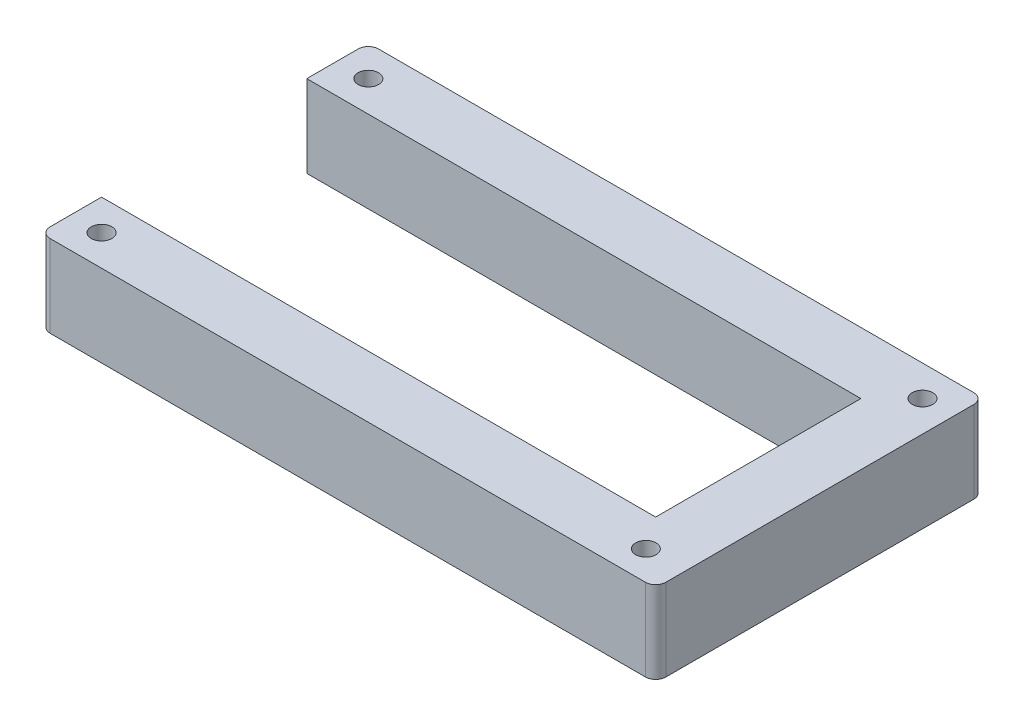
ISO-10303-21;
HEADER;
FILE_DESCRIPTION(('STEP AP214'),'2;1');
FILE_NAME('part.step','',(''),(''),'','','');
FILE_SCHEMA(('AUTOMOTIVE_DESIGN { 1 0 10303 214 1 1 1 1 }'));
ENDSEC;
DATA;
#1=APPLICATION_CONTEXT('core data for automotive mechanical design processes');
#2=APPLICATION_PROTOCOL_DEFINITION('international standard','automotive_design',2000,#1);
#3=PRODUCT_CONTEXT('',#1,'mechanical');
#4=PRODUCT('Part','Part','',(#3));
#5=PRODUCT_RELATED_PRODUCT_CATEGORY('part','',(#4));
#6=PRODUCT_DEFINITION_FORMATION('','',#4);
#7=PRODUCT_DEFINITION_CONTEXT('part definition',#1,'design');
#8=PRODUCT_DEFINITION('design','',#6,#7);
#9=PRODUCT_DEFINITION_SHAPE('','',#8);
#10=(LENGTH_UNIT() NAMED_UNIT(*) SI_UNIT(.MILLI.,.METRE.));
#11=(NAMED_UNIT(*) PLANE_ANGLE_UNIT() SI_UNIT($,.RADIAN.));
#12=(NAMED_UNIT(*) SI_UNIT($,.STERADIAN.) SOLID_ANGLE_UNIT());
#13=UNCERTAINTY_MEASURE_WITH_UNIT(LENGTH_MEASURE(1.E-05),#10,'distance_accuracy_value','');
#14=(GEOMETRIC_REPRESENTATION_CONTEXT(3) GLOBAL_UNCERTAINTY_ASSIGNED_CONTEXT((#13)) GLOBAL_UNIT_ASSIGNED_CONTEXT((#10,
#11,#12)) REPRESENTATION_CONTEXT('',''));
#15=CARTESIAN_POINT('',(0.,0.,0.));
#16=DIRECTION('',(0.,0.,1.));
#17=DIRECTION('',(1.,0.,0.));
#18=AXIS2_PLACEMENT_3D('',#15,#16,#17);
#19=CARTESIAN_POINT('',(63.5,508.,-63.5));
#20=DIRECTION('',(0.,-1.,0.));
#21=DIRECTION('',(0.,0.,-1.));
#22=AXIS2_PLACEMENT_3D('',#19,#20,#21);
#23=PLANE('',#22);
#24=DIRECTION('',(1.,0.,0.));
#25=VECTOR('',#24,1.);
#26=CARTESIAN_POINT('',(0.,508.,-1651.));
#27=LINE('',#26,#25);
#28=CARTESIAN_POINT('',(0.,508.,-1651.));
#29=VERTEX_POINT('',#28);
#30=CARTESIAN_POINT('',(3429.,508.,-1651.));
#31=VERTEX_POINT('',#30);
#32=EDGE_CURVE('E190',#29,#31,#27,.T.);
#33=ORIENTED_EDGE('',*,*,#32,.T.);
#34=DIRECTION('',(0.,0.,1.));
#35=VECTOR('',#34,1.);
#36=CARTESIAN_POINT('',(3429.,508.,-1651.));
#37=LINE('',#36,#35);
#38=CARTESIAN_POINT('',(3429.,508.,-381.));
#39=VERTEX_POINT('',#38);
#40=EDGE_CURVE('E113',#31,#39,#37,.T.);
#41=ORIENTED_EDGE('',*,*,#40,.T.);
#42=DIRECTION('',(-1.,0.,0.));
#43=VECTOR('',#42,1.);
#44=CARTESIAN_POINT('',(3429.,508.,-381.));
#45=LINE('',#44,#43);
#46=CARTESIAN_POINT('',(0.,508.,-381.));
#47=VERTEX_POINT('',#46);
#48=EDGE_CURVE('E215',#39,#47,#45,.T.);
#49=ORIENTED_EDGE('',*,*,#48,.T.);
#50=DIRECTION('',(0.,0.,1.));
#51=VECTOR('',#50,1.);
#52=CARTESIAN_POINT('',(0.,508.,-381.));
#53=LINE('',#52,#51);
#54=CARTESIAN_POINT('',(0.,508.,-63.5000000000004));
#55=VERTEX_POINT('',#54);
#56=EDGE_CURVE('E232',#47,#55,#53,.T.);
#57=ORIENTED_EDGE('',*,*,#56,.T.);
#58=CARTESIAN_POINT('',(63.5,508.,-63.5));
#59=DIRECTION('',(0.,1.,0.));
#60=DIRECTION('',(0.,0.,-1.));
#61=AXIS2_PLACEMENT_3D('',#58,#59,#60);
#62=CIRCLE('',#61,63.5);
#63=CARTESIAN_POINT('',(63.5000000000005,508.,0.));
#64=VERTEX_POINT('',#63);
#65=EDGE_CURVE('E229',#55,#64,#62,.T.);
#66=ORIENTED_EDGE('',*,*,#65,.T.);
#67=DIRECTION('',(1.,0.,0.));
#68=VECTOR('',#67,1.);
#69=CARTESIAN_POINT('',(63.5000000000005,508.,0.));
#70=LINE('',#69,#68);
#71=CARTESIAN_POINT('',(3746.5,508.,0.));
#72=VERTEX_POINT('',#71);
#73=EDGE_CURVE('E235',#64,#72,#70,.T.);
#74=ORIENTED_EDGE('',*,*,#73,.T.);
#75=CARTESIAN_POINT('',(3746.5,508.,-63.5));
#76=DIRECTION('',(0.,1.,0.));
#77=DIRECTION('',(0.,0.,1.));
#78=AXIS2_PLACEMENT_3D('',#75,#76,#77);
#79=CIRCLE('',#78,63.4999999999999);
#80=CARTESIAN_POINT('',(3810.,508.,-63.5000000000005));
#81=VERTEX_POINT('',#80);
#82=EDGE_CURVE('E234',#72,#81,#79,.T.);
#83=ORIENTED_EDGE('',*,*,#82,.T.);
#84=DIRECTION('',(0.,0.,-1.));
#85=VECTOR('',#84,1.);
#86=CARTESIAN_POINT('',(3810.,508.,-63.5000000000005));
#87=LINE('',#86,#85);
#88=CARTESIAN_POINT('',(3810.,508.,-1968.5));
#89=VERTEX_POINT('',#88);
#90=EDGE_CURVE('E241',#81,#89,#87,.T.);
#91=ORIENTED_EDGE('',*,*,#90,.T.);
#92=CARTESIAN_POINT('',(3746.5,508.,-1968.5));
#93=DIRECTION('',(0.,1.,0.));
#94=DIRECTION('',(0.,0.,1.));
#95=AXIS2_PLACEMENT_3D('',#92,#93,#94);
#96=CIRCLE('',#95,63.4999999999999);
#97=CARTESIAN_POINT('',(3746.5,508.,-2032.));
#98=VERTEX_POINT('',#97);
#99=EDGE_CURVE('E147',#89,#98,#96,.T.);
#100=ORIENTED_EDGE('',*,*,#99,.T.);
#101=DIRECTION('',(-1.,0.,0.));
#102=VECTOR('',#101,1.);
#103=CARTESIAN_POINT('',(3746.5,508.,-2032.));
#104=LINE('',#103,#102);
#105=CARTESIAN_POINT('',(63.5000000000005,508.,-2032.));
#106=VERTEX_POINT('',#105);
#107=EDGE_CURVE('E139',#98,#106,#104,.T.);
#108=ORIENTED_EDGE('',*,*,#107,.T.);
#109=CARTESIAN_POINT('',(63.5,508.,-1968.5));
#110=DIRECTION('',(0.,1.,0.));
#111=DIRECTION('',(0.,0.,1.));
#112=AXIS2_PLACEMENT_3D('',#109,#110,#111);
#113=CIRCLE('',#112,63.4999999999999);
#114=CARTESIAN_POINT('',(0.,508.,-1968.5));
#115=VERTEX_POINT('',#114);
#116=EDGE_CURVE('E143',#106,#115,#113,.T.);
#117=ORIENTED_EDGE('',*,*,#116,.T.);
#118=DIRECTION('',(0.,0.,1.));
#119=VECTOR('',#118,1.);
#120=CARTESIAN_POINT('',(0.,508.,-1968.5));
#121=LINE('',#120,#119);
#122=EDGE_CURVE('E58',#115,#29,#121,.T.);
#123=ORIENTED_EDGE('',*,*,#122,.T.);
#124=EDGE_LOOP('',(#33,#41,#49,#57,#66,#74,#83,#91,#100,#108,#117,#123));
#125=FACE_BOUND('',#124,.T.);
#126=CARTESIAN_POINT('',(190.5,508.,-1841.5));
#127=DIRECTION('',(0.,1.,0.));
#128=DIRECTION('',(0.,0.,1.));
#129=AXIS2_PLACEMENT_3D('',#126,#127,#128);
#130=CIRCLE('',#129,63.5);
#131=CARTESIAN_POINT('',(190.5,508.,-1778.));
#132=VERTEX_POINT('',#131);
#133=EDGE_CURVE('E166',#132,#132,#130,.T.);
#134=ORIENTED_EDGE('',*,*,#133,.F.);
#135=EDGE_LOOP('',(#134));
#136=FACE_BOUND('',#135,.T.);
#137=CARTESIAN_POINT('',(190.5,508.,-190.5));
#138=DIRECTION('',(0.,1.,0.));
#139=DIRECTION('',(0.,0.,1.));
#140=AXIS2_PLACEMENT_3D('',#137,#138,#139);
#141=CIRCLE('',#140,63.5);
#142=CARTESIAN_POINT('',(190.5,508.,-127.));
#143=VERTEX_POINT('',#142);
#144=EDGE_CURVE('E304',#143,#143,#141,.T.);
#145=ORIENTED_EDGE('',*,*,#144,.F.);
#146=EDGE_LOOP('',(#145));
#147=FACE_BOUND('',#146,.T.);
#148=CARTESIAN_POINT('',(3568.73960956834,508.,-180.492968070862));
#149=DIRECTION('',(0.,1.,0.));
#150=DIRECTION('',(0.,0.,1.));
#151=AXIS2_PLACEMENT_3D('',#148,#149,#150);
#152=CIRCLE('',#151,63.4999999999999);
#153=CARTESIAN_POINT('',(3568.73960956834,508.,-116.992968070862));
#154=VERTEX_POINT('',#153);
#155=EDGE_CURVE('E298',#154,#154,#152,.T.);
#156=ORIENTED_EDGE('',*,*,#155,.F.);
#157=EDGE_LOOP('',(#156));
#158=FACE_BOUND('',#157,.T.);
#159=CARTESIAN_POINT('',(3619.5,508.,-1841.5));
#160=DIRECTION('',(0.,1.,0.));
#161=DIRECTION('',(0.,0.,1.));
#162=AXIS2_PLACEMENT_3D('',#159,#160,#161);
#163=CIRCLE('',#162,63.4999999999998);
#164=CARTESIAN_POINT('',(3619.5,508.,-1778.));
#165=VERTEX_POINT('',#164);
#166=EDGE_CURVE('E290',#165,#165,#163,.T.);
#167=ORIENTED_EDGE('',*,*,#166,.F.);
#168=EDGE_LOOP('',(#167));
#169=FACE_BOUND('',#168,.T.);
#170=ADVANCED_FACE('F43',(#125,#136,#147,#158,#169),#23,.F.);
#171=CARTESIAN_POINT('',(63.5,0.,-63.5));
#172=DIRECTION('',(0.,-1.,0.));
#173=DIRECTION('',(0.,0.,-1.));
#174=AXIS2_PLACEMENT_3D('',#171,#172,#173);
#175=PLANE('',#174);
#176=CARTESIAN_POINT('',(3568.73960956834,0.,-180.492968070862));
#177=DIRECTION('',(0.,1.,0.));
#178=DIRECTION('',(0.,0.,1.));
#179=AXIS2_PLACEMENT_3D('',#176,#177,#178);
#180=CIRCLE('',#179,63.4999999999999);
#181=CARTESIAN_POINT('',(3568.73960956834,0.,-116.992968070862));
#182=VERTEX_POINT('',#181);
#183=EDGE_CURVE('E296',#182,#182,#180,.T.);
#184=ORIENTED_EDGE('',*,*,#183,.T.);
#185=EDGE_LOOP('',(#184));
#186=FACE_BOUND('',#185,.T.);
#187=CARTESIAN_POINT('',(190.5,0.,-1841.5));
#188=DIRECTION('',(0.,1.,0.));
#189=DIRECTION('',(0.,0.,1.));
#190=AXIS2_PLACEMENT_3D('',#187,#188,#189);
#191=CIRCLE('',#190,63.5);
#192=CARTESIAN_POINT('',(190.5,0.,-1778.));
#193=VERTEX_POINT('',#192);
#194=EDGE_CURVE('E306',#193,#193,#191,.T.);
#195=ORIENTED_EDGE('',*,*,#194,.T.);
#196=EDGE_LOOP('',(#195));
#197=FACE_BOUND('',#196,.T.);
#198=DIRECTION('',(1.,0.,0.));
#199=VECTOR('',#198,1.);
#200=CARTESIAN_POINT('',(0.,0.,-1651.));
#201=LINE('',#200,#199);
#202=CARTESIAN_POINT('',(0.,0.,-1651.));
#203=VERTEX_POINT('',#202);
#204=CARTESIAN_POINT('',(3429.,0.,-1651.));
#205=VERTEX_POINT('',#204);
#206=EDGE_CURVE('E163',#203,#205,#201,.T.);
#207=ORIENTED_EDGE('',*,*,#206,.F.);
#208=DIRECTION('',(0.,0.,1.));
#209=VECTOR('',#208,1.);
#210=CARTESIAN_POINT('',(0.,0.,-1968.5));
#211=LINE('',#210,#209);
#212=CARTESIAN_POINT('',(0.,0.,-1968.5));
#213=VERTEX_POINT('',#212);
#214=EDGE_CURVE('E107',#213,#203,#211,.T.);
#215=ORIENTED_EDGE('',*,*,#214,.F.);
#216=CARTESIAN_POINT('',(63.5,0.,-1968.5));
#217=DIRECTION('',(0.,1.,0.));
#218=DIRECTION('',(0.,0.,1.));
#219=AXIS2_PLACEMENT_3D('',#216,#217,#218);
#220=CIRCLE('',#219,63.4999999999999);
#221=CARTESIAN_POINT('',(63.5000000000005,0.,-2032.));
#222=VERTEX_POINT('',#221);
#223=EDGE_CURVE('E102',#222,#213,#220,.T.);
#224=ORIENTED_EDGE('',*,*,#223,.F.);
#225=DIRECTION('',(-1.,0.,0.));
#226=VECTOR('',#225,1.);
#227=CARTESIAN_POINT('',(3746.5,0.,-2032.));
#228=LINE('',#227,#226);
#229=CARTESIAN_POINT('',(3746.5,0.,-2032.));
#230=VERTEX_POINT('',#229);
#231=EDGE_CURVE('E153',#230,#222,#228,.T.);
#232=ORIENTED_EDGE('',*,*,#231,.F.);
#233=CARTESIAN_POINT('',(3746.5,0.,-1968.5));
#234=DIRECTION('',(0.,1.,0.));
#235=DIRECTION('',(0.,0.,1.));
#236=AXIS2_PLACEMENT_3D('',#233,#234,#235);
#237=CIRCLE('',#236,63.4999999999999);
#238=CARTESIAN_POINT('',(3810.,0.,-1968.5));
#239=VERTEX_POINT('',#238);
#240=EDGE_CURVE('E185',#239,#230,#237,.T.);
#241=ORIENTED_EDGE('',*,*,#240,.F.);
#242=DIRECTION('',(0.,0.,-1.));
#243=VECTOR('',#242,1.);
#244=CARTESIAN_POINT('',(3810.,0.,-63.5000000000005));
#245=LINE('',#244,#243);
#246=CARTESIAN_POINT('',(3810.,0.,-63.5000000000005));
#247=VERTEX_POINT('',#246);
#248=EDGE_CURVE('E179',#247,#239,#245,.T.);
#249=ORIENTED_EDGE('',*,*,#248,.F.);
#250=CARTESIAN_POINT('',(3746.5,0.,-63.5));
#251=DIRECTION('',(0.,1.,0.));
#252=DIRECTION('',(0.,0.,1.));
#253=AXIS2_PLACEMENT_3D('',#250,#251,#252);
#254=CIRCLE('',#253,63.4999999999999);
#255=CARTESIAN_POINT('',(3746.5,0.,0.));
#256=VERTEX_POINT('',#255);
#257=EDGE_CURVE('E178',#256,#247,#254,.T.);
#258=ORIENTED_EDGE('',*,*,#257,.F.);
#259=DIRECTION('',(1.,0.,0.));
#260=VECTOR('',#259,1.);
#261=CARTESIAN_POINT('',(63.5000000000005,0.,0.));
#262=LINE('',#261,#260);
#263=CARTESIAN_POINT('',(63.5000000000005,0.,0.));
#264=VERTEX_POINT('',#263);
#265=EDGE_CURVE('E176',#264,#256,#262,.T.);
#266=ORIENTED_EDGE('',*,*,#265,.F.);
#267=CARTESIAN_POINT('',(63.5,0.,-63.5));
#268=DIRECTION('',(0.,1.,0.));
#269=DIRECTION('',(0.,0.,-1.));
#270=AXIS2_PLACEMENT_3D('',#267,#268,#269);
#271=CIRCLE('',#270,63.5);
#272=CARTESIAN_POINT('',(0.,0.,-63.5000000000004));
#273=VERTEX_POINT('',#272);
#274=EDGE_CURVE('E174',#273,#264,#271,.T.);
#275=ORIENTED_EDGE('',*,*,#274,.F.);
#276=DIRECTION('',(0.,0.,1.));
#277=VECTOR('',#276,1.);
#278=CARTESIAN_POINT('',(0.,0.,-381.));
#279=LINE('',#278,#277);
#280=CARTESIAN_POINT('',(0.,0.,-381.));
#281=VERTEX_POINT('',#280);
#282=EDGE_CURVE('E175',#281,#273,#279,.T.);
#283=ORIENTED_EDGE('',*,*,#282,.F.);
#284=DIRECTION('',(-1.,0.,0.));
#285=VECTOR('',#284,1.);
#286=CARTESIAN_POINT('',(3429.,0.,-381.));
#287=LINE('',#286,#285);
#288=CARTESIAN_POINT('',(3429.,0.,-381.));
#289=VERTEX_POINT('',#288);
#290=EDGE_CURVE('E169',#289,#281,#287,.T.);
#291=ORIENTED_EDGE('',*,*,#290,.F.);
#292=DIRECTION('',(0.,0.,1.));
#293=VECTOR('',#292,1.);
#294=CARTESIAN_POINT('',(3429.,0.,-1651.));
#295=LINE('',#294,#293);
#296=EDGE_CURVE('E167',#205,#289,#295,.T.);
#297=ORIENTED_EDGE('',*,*,#296,.F.);
#298=EDGE_LOOP('',(#207,#215,#224,#232,#241,#249,#258,#266,#275,#283,#291,#297));
#299=FACE_BOUND('',#298,.T.);
#300=CARTESIAN_POINT('',(190.5,0.,-190.5));
#301=DIRECTION('',(0.,1.,0.));
#302=DIRECTION('',(0.,0.,1.));
#303=AXIS2_PLACEMENT_3D('',#300,#301,#302);
#304=CIRCLE('',#303,63.5);
#305=CARTESIAN_POINT('',(190.5,0.,-127.));
#306=VERTEX_POINT('',#305);
#307=EDGE_CURVE('E302',#306,#306,#304,.T.);
#308=ORIENTED_EDGE('',*,*,#307,.T.);
#309=EDGE_LOOP('',(#308));
#310=FACE_BOUND('',#309,.T.);
#311=CARTESIAN_POINT('',(3619.5,0.,-1841.5));
#312=DIRECTION('',(0.,1.,0.));
#313=DIRECTION('',(0.,0.,1.));
#314=AXIS2_PLACEMENT_3D('',#311,#312,#313);
#315=CIRCLE('',#314,63.4999999999998);
#316=CARTESIAN_POINT('',(3619.5,0.,-1778.));
#317=VERTEX_POINT('',#316);
#318=EDGE_CURVE('E291',#317,#317,#315,.T.);
#319=ORIENTED_EDGE('',*,*,#318,.T.);
#320=EDGE_LOOP('',(#319));
#321=FACE_BOUND('',#320,.T.);
#322=ADVANCED_FACE('F216',(#186,#197,#299,#310,#321),#175,.T.);
#323=CARTESIAN_POINT('',(0.,508.,-1651.));
#324=DIRECTION('',(0.,0.,-1.));
#325=DIRECTION('',(-1.,0.,0.));
#326=AXIS2_PLACEMENT_3D('',#323,#324,#325);
#327=PLANE('',#326);
#328=ORIENTED_EDGE('',*,*,#206,.T.);
#329=DIRECTION('',(0.,-1.,0.));
#330=VECTOR('',#329,1.);
#331=CARTESIAN_POINT('',(3429.,508.,-1651.));
#332=LINE('',#331,#330);
#333=EDGE_CURVE('E11',#31,#205,#332,.T.);
#334=ORIENTED_EDGE('',*,*,#333,.F.);
#335=ORIENTED_EDGE('',*,*,#32,.F.);
#336=DIRECTION('',(0.,-1.,0.));
#337=VECTOR('',#336,1.);
#338=CARTESIAN_POINT('',(0.,508.,-1651.));
#339=LINE('',#338,#337);
#340=EDGE_CURVE('E158',#29,#203,#339,.T.);
#341=ORIENTED_EDGE('',*,*,#340,.T.);
#342=EDGE_LOOP('',(#328,#334,#335,#341));
#343=FACE_BOUND('',#342,.T.);
#344=ADVANCED_FACE('F44',(#343),#327,.F.);
#345=CARTESIAN_POINT('',(3429.,508.,-1651.));
#346=DIRECTION('',(1.,0.,0.));
#347=DIRECTION('',(0.,0.,-1.));
#348=AXIS2_PLACEMENT_3D('',#345,#346,#347);
#349=PLANE('',#348);
#350=ORIENTED_EDGE('',*,*,#296,.T.);
#351=DIRECTION('',(0.,-1.,0.));
#352=VECTOR('',#351,1.);
#353=CARTESIAN_POINT('',(3429.,508.,-381.));
#354=LINE('',#353,#352);
#355=EDGE_CURVE('E55',#39,#289,#354,.T.);
#356=ORIENTED_EDGE('',*,*,#355,.F.);
#357=ORIENTED_EDGE('',*,*,#40,.F.);
#358=ORIENTED_EDGE('',*,*,#333,.T.);
#359=EDGE_LOOP('',(#350,#356,#357,#358));
#360=FACE_BOUND('',#359,.T.);
#361=ADVANCED_FACE('F423',(#360),#349,.F.);
#362=CARTESIAN_POINT('',(3429.,508.,-381.));
#363=DIRECTION('',(0.,0.,1.));
#364=DIRECTION('',(1.,0.,0.));
#365=AXIS2_PLACEMENT_3D('',#362,#363,#364);
#366=PLANE('',#365);
#367=ORIENTED_EDGE('',*,*,#290,.T.);
#368=DIRECTION('',(0.,-1.,0.));
#369=VECTOR('',#368,1.);
#370=CARTESIAN_POINT('',(0.,508.,-381.));
#371=LINE('',#370,#369);
#372=EDGE_CURVE('E206',#47,#281,#371,.T.);
#373=ORIENTED_EDGE('',*,*,#372,.F.);
#374=ORIENTED_EDGE('',*,*,#48,.F.);
#375=ORIENTED_EDGE('',*,*,#355,.T.);
#376=EDGE_LOOP('',(#367,#373,#374,#375));
#377=FACE_BOUND('',#376,.T.);
#378=ADVANCED_FACE('F212',(#377),#366,.F.);
#379=CARTESIAN_POINT('',(0.,508.,-381.));
#380=DIRECTION('',(1.,0.,0.));
#381=DIRECTION('',(0.,0.,-1.));
#382=AXIS2_PLACEMENT_3D('',#379,#380,#381);
#383=PLANE('',#382);
#384=ORIENTED_EDGE('',*,*,#282,.T.);
#385=DIRECTION('',(0.,-1.,0.));
#386=VECTOR('',#385,1.);
#387=CARTESIAN_POINT('',(0.,508.,-63.5000000000004));
#388=LINE('',#387,#386);
#389=EDGE_CURVE('E201',#55,#273,#388,.T.);
#390=ORIENTED_EDGE('',*,*,#389,.F.);
#391=ORIENTED_EDGE('',*,*,#56,.F.);
#392=ORIENTED_EDGE('',*,*,#372,.T.);
#393=EDGE_LOOP('',(#384,#390,#391,#392));
#394=FACE_BOUND('',#393,.T.);
#395=ADVANCED_FACE('F222',(#394),#383,.F.);
#396=CARTESIAN_POINT('',(63.5,508.,-63.5));
#397=DIRECTION('',(0.,-1.,0.));
#398=DIRECTION('',(0.,0.,-1.));
#399=AXIS2_PLACEMENT_3D('',#396,#397,#398);
#400=CYLINDRICAL_SURFACE('',#399,63.5);
#401=ORIENTED_EDGE('',*,*,#274,.T.);
#402=DIRECTION('',(0.,-1.,0.));
#403=VECTOR('',#402,1.);
#404=CARTESIAN_POINT('',(63.5000000000005,508.,0.));
#405=LINE('',#404,#403);
#406=EDGE_CURVE('E200',#64,#264,#405,.T.);
#407=ORIENTED_EDGE('',*,*,#406,.F.);
#408=ORIENTED_EDGE('',*,*,#65,.F.);
#409=ORIENTED_EDGE('',*,*,#389,.T.);
#410=EDGE_LOOP('',(#401,#407,#408,#409));
#411=FACE_BOUND('',#410,.T.);
#412=ADVANCED_FACE('F228',(#411),#400,.T.);
#413=CARTESIAN_POINT('',(63.5000000000005,508.,0.));
#414=DIRECTION('',(0.,0.,-1.));
#415=DIRECTION('',(-1.,0.,0.));
#416=AXIS2_PLACEMENT_3D('',#413,#414,#415);
#417=PLANE('',#416);
#418=ORIENTED_EDGE('',*,*,#265,.T.);
#419=DIRECTION('',(0.,-1.,0.));
#420=VECTOR('',#419,1.);
#421=CARTESIAN_POINT('',(3746.5,508.,0.));
#422=LINE('',#421,#420);
#423=EDGE_CURVE('E197',#72,#256,#422,.T.);
#424=ORIENTED_EDGE('',*,*,#423,.F.);
#425=ORIENTED_EDGE('',*,*,#73,.F.);
#426=ORIENTED_EDGE('',*,*,#406,.T.);
#427=EDGE_LOOP('',(#418,#424,#425,#426));
#428=FACE_BOUND('',#427,.T.);
#429=ADVANCED_FACE('F388',(#428),#417,.F.);
#430=CARTESIAN_POINT('',(3746.5,508.,-63.5));
#431=DIRECTION('',(0.,-1.,0.));
#432=DIRECTION('',(0.,0.,-1.));
#433=AXIS2_PLACEMENT_3D('',#430,#431,#432);
#434=CYLINDRICAL_SURFACE('',#433,63.4999999999999);
#435=ORIENTED_EDGE('',*,*,#257,.T.);
#436=DIRECTION('',(0.,-1.,0.));
#437=VECTOR('',#436,1.);
#438=CARTESIAN_POINT('',(3810.,508.,-63.5000000000005));
#439=LINE('',#438,#437);
#440=EDGE_CURVE('E191',#81,#247,#439,.T.);
#441=ORIENTED_EDGE('',*,*,#440,.F.);
#442=ORIENTED_EDGE('',*,*,#82,.F.);
#443=ORIENTED_EDGE('',*,*,#423,.T.);
#444=EDGE_LOOP('',(#435,#441,#442,#443));
#445=FACE_BOUND('',#444,.T.);
#446=ADVANCED_FACE('F380',(#445),#434,.T.);
#447=CARTESIAN_POINT('',(3810.,508.,-63.5000000000005));
#448=DIRECTION('',(-1.,0.,0.));
#449=DIRECTION('',(0.,0.,1.));
#450=AXIS2_PLACEMENT_3D('',#447,#448,#449);
#451=PLANE('',#450);
#452=ORIENTED_EDGE('',*,*,#248,.T.);
#453=DIRECTION('',(0.,-1.,0.));
#454=VECTOR('',#453,1.);
#455=CARTESIAN_POINT('',(3810.,508.,-1968.5));
#456=LINE('',#455,#454);
#457=EDGE_CURVE('E192',#89,#239,#456,.T.);
#458=ORIENTED_EDGE('',*,*,#457,.F.);
#459=ORIENTED_EDGE('',*,*,#90,.F.);
#460=ORIENTED_EDGE('',*,*,#440,.T.);
#461=EDGE_LOOP('',(#452,#458,#459,#460));
#462=FACE_BOUND('',#461,.T.);
#463=ADVANCED_FACE('F250',(#462),#451,.F.);
#464=CARTESIAN_POINT('',(3746.5,508.,-1968.5));
#465=DIRECTION('',(0.,-1.,0.));
#466=DIRECTION('',(0.,0.,-1.));
#467=AXIS2_PLACEMENT_3D('',#464,#465,#466);
#468=CYLINDRICAL_SURFACE('',#467,63.4999999999999);
#469=ORIENTED_EDGE('',*,*,#240,.T.);
#470=DIRECTION('',(0.,-1.,0.));
#471=VECTOR('',#470,1.);
#472=CARTESIAN_POINT('',(3746.5,508.,-2032.));
#473=LINE('',#472,#471);
#474=EDGE_CURVE('E155',#98,#230,#473,.T.);
#475=ORIENTED_EDGE('',*,*,#474,.F.);
#476=ORIENTED_EDGE('',*,*,#99,.F.);
#477=ORIENTED_EDGE('',*,*,#457,.T.);
#478=EDGE_LOOP('',(#469,#475,#476,#477));
#479=FACE_BOUND('',#478,.T.);
#480=ADVANCED_FACE('F251',(#479),#468,.T.);
#481=CARTESIAN_POINT('',(3746.5,508.,-2032.));
#482=DIRECTION('',(0.,0.,1.));
#483=DIRECTION('',(1.,0.,0.));
#484=AXIS2_PLACEMENT_3D('',#481,#482,#483);
#485=PLANE('',#484);
#486=ORIENTED_EDGE('',*,*,#231,.T.);
#487=DIRECTION('',(0.,-1.,0.));
#488=VECTOR('',#487,1.);
#489=CARTESIAN_POINT('',(63.5000000000005,508.,-2032.));
#490=LINE('',#489,#488);
#491=EDGE_CURVE('E151',#106,#222,#490,.T.);
#492=ORIENTED_EDGE('',*,*,#491,.F.);
#493=ORIENTED_EDGE('',*,*,#107,.F.);
#494=ORIENTED_EDGE('',*,*,#474,.T.);
#495=EDGE_LOOP('',(#486,#492,#493,#494));
#496=FACE_BOUND('',#495,.T.);
#497=ADVANCED_FACE('F152',(#496),#485,.F.);
#498=CARTESIAN_POINT('',(63.5,508.,-1968.5));
#499=DIRECTION('',(0.,-1.,0.));
#500=DIRECTION('',(0.,0.,-1.));
#501=AXIS2_PLACEMENT_3D('',#498,#499,#500);
#502=CYLINDRICAL_SURFACE('',#501,63.4999999999999);
#503=ORIENTED_EDGE('',*,*,#223,.T.);
#504=DIRECTION('',(0.,-1.,0.));
#505=VECTOR('',#504,1.);
#506=CARTESIAN_POINT('',(0.,508.,-1968.5));
#507=LINE('',#506,#505);
#508=EDGE_CURVE('E157',#115,#213,#507,.T.);
#509=ORIENTED_EDGE('',*,*,#508,.F.);
#510=ORIENTED_EDGE('',*,*,#116,.F.);
#511=ORIENTED_EDGE('',*,*,#491,.T.);
#512=EDGE_LOOP('',(#503,#509,#510,#511));
#513=FACE_BOUND('',#512,.T.);
#514=ADVANCED_FACE('F156',(#513),#502,.T.);
#515=CARTESIAN_POINT('',(0.,508.,-1968.5));
#516=DIRECTION('',(1.,0.,0.));
#517=DIRECTION('',(0.,0.,-1.));
#518=AXIS2_PLACEMENT_3D('',#515,#516,#517);
#519=PLANE('',#518);
#520=ORIENTED_EDGE('',*,*,#214,.T.);
#521=ORIENTED_EDGE('',*,*,#340,.F.);
#522=ORIENTED_EDGE('',*,*,#122,.F.);
#523=ORIENTED_EDGE('',*,*,#508,.T.);
#524=EDGE_LOOP('',(#520,#521,#522,#523));
#525=FACE_BOUND('',#524,.T.);
#526=ADVANCED_FACE('F255',(#525),#519,.F.);
#527=CARTESIAN_POINT('',(190.5,508.,-1841.5));
#528=DIRECTION('',(0.,-1.,0.));
#529=DIRECTION('',(0.,0.,-1.));
#530=AXIS2_PLACEMENT_3D('',#527,#528,#529);
#531=CYLINDRICAL_SURFACE('',#530,63.5);
#532=ORIENTED_EDGE('',*,*,#133,.T.);
#533=EDGE_LOOP('',(#532));
#534=FACE_BOUND('',#533,.T.);
#535=ORIENTED_EDGE('',*,*,#194,.F.);
#536=EDGE_LOOP('',(#535));
#537=FACE_BOUND('',#536,.T.);
#538=ADVANCED_FACE('F257',(#534,#537),#531,.F.);
#539=CARTESIAN_POINT('',(190.5,508.,-190.5));
#540=DIRECTION('',(0.,-1.,0.));
#541=DIRECTION('',(0.,0.,-1.));
#542=AXIS2_PLACEMENT_3D('',#539,#540,#541);
#543=CYLINDRICAL_SURFACE('',#542,63.5);
#544=ORIENTED_EDGE('',*,*,#144,.T.);
#545=EDGE_LOOP('',(#544));
#546=FACE_BOUND('',#545,.T.);
#547=ORIENTED_EDGE('',*,*,#307,.F.);
#548=EDGE_LOOP('',(#547));
#549=FACE_BOUND('',#548,.T.);
#550=ADVANCED_FACE('F261',(#546,#549),#543,.F.);
#551=CARTESIAN_POINT('',(3568.73960956834,508.,-180.492968070862));
#552=DIRECTION('',(0.,-1.,0.));
#553=DIRECTION('',(0.,0.,-1.));
#554=AXIS2_PLACEMENT_3D('',#551,#552,#553);
#555=CYLINDRICAL_SURFACE('',#554,63.4999999999999);
#556=ORIENTED_EDGE('',*,*,#155,.T.);
#557=EDGE_LOOP('',(#556));
#558=FACE_BOUND('',#557,.T.);
#559=ORIENTED_EDGE('',*,*,#183,.F.);
#560=EDGE_LOOP('',(#559));
#561=FACE_BOUND('',#560,.T.);
#562=ADVANCED_FACE('F280',(#558,#561),#555,.F.);
#563=CARTESIAN_POINT('',(3619.5,508.,-1841.5));
#564=DIRECTION('',(0.,-1.,0.));
#565=DIRECTION('',(0.,0.,-1.));
#566=AXIS2_PLACEMENT_3D('',#563,#564,#565);
#567=CYLINDRICAL_SURFACE('',#566,63.4999999999998);
#568=ORIENTED_EDGE('',*,*,#166,.T.);
#569=EDGE_LOOP('',(#568));
#570=FACE_BOUND('',#569,.T.);
#571=ORIENTED_EDGE('',*,*,#318,.F.);
#572=EDGE_LOOP('',(#571));
#573=FACE_BOUND('',#572,.T.);
#574=ADVANCED_FACE('F282',(#570,#573),#567,.F.);
#575=CLOSED_SHELL('',(#170,#322,#344,#361,#378,#395,#412,#429,#446,#463,#480,#497,#514,#526,
#538,#550,#562,#574));
#576=MANIFOLD_SOLID_BREP('B2',#575);
#577=ADVANCED_BREP_SHAPE_REPRESENTATION('',(#18,#576),#14);
#578=SHAPE_DEFINITION_REPRESENTATION(#9,#577);
ENDSEC;
END-ISO-10303-21;
